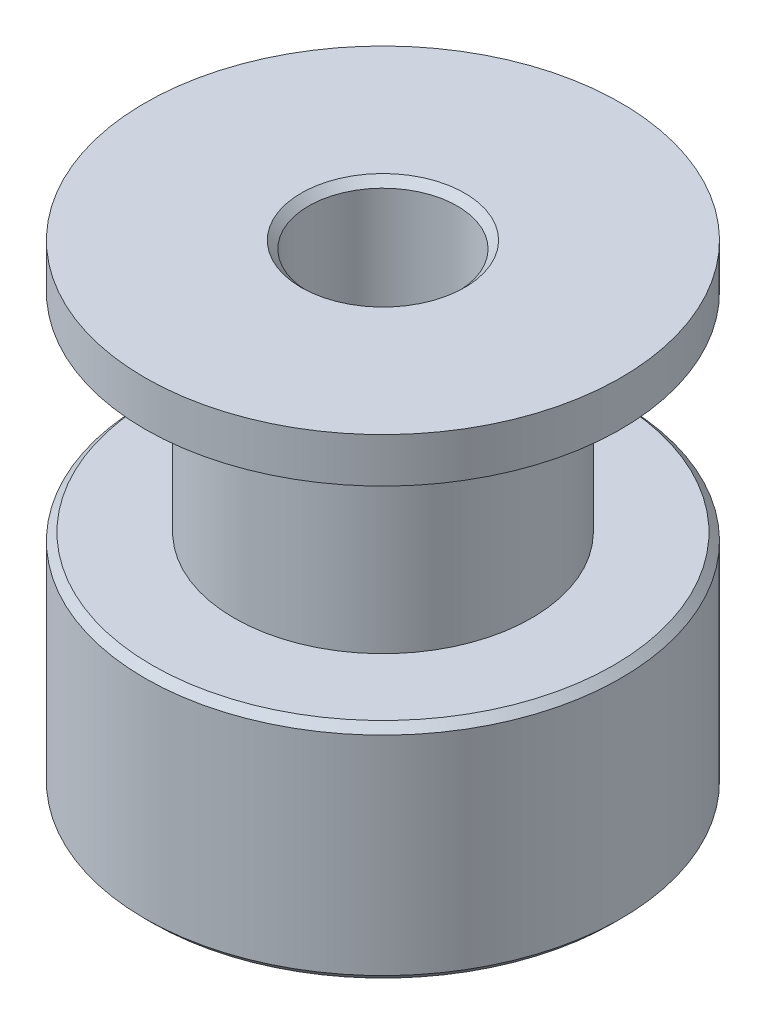
ISO-10303-21;
HEADER;
FILE_DESCRIPTION(('STEP AP214'),'2;1');
FILE_NAME('part.step','',(''),(''),'','','');
FILE_SCHEMA(('AUTOMOTIVE_DESIGN { 1 0 10303 214 1 1 1 1 }'));
ENDSEC;
DATA;
#1=APPLICATION_CONTEXT('core data for automotive mechanical design processes');
#2=APPLICATION_PROTOCOL_DEFINITION('international standard','automotive_design',2000,#1);
#3=PRODUCT_CONTEXT('',#1,'mechanical');
#4=PRODUCT('Part','Part','',(#3));
#5=PRODUCT_RELATED_PRODUCT_CATEGORY('part','',(#4));
#6=PRODUCT_DEFINITION_FORMATION('','',#4);
#7=PRODUCT_DEFINITION_CONTEXT('part definition',#1,'design');
#8=PRODUCT_DEFINITION('design','',#6,#7);
#9=PRODUCT_DEFINITION_SHAPE('','',#8);
#10=(LENGTH_UNIT() NAMED_UNIT(*) SI_UNIT(.MILLI.,.METRE.));
#11=(NAMED_UNIT(*) PLANE_ANGLE_UNIT() SI_UNIT($,.RADIAN.));
#12=(NAMED_UNIT(*) SI_UNIT($,.STERADIAN.) SOLID_ANGLE_UNIT());
#13=UNCERTAINTY_MEASURE_WITH_UNIT(LENGTH_MEASURE(1.E-05),#10,'distance_accuracy_value','');
#14=(GEOMETRIC_REPRESENTATION_CONTEXT(3) GLOBAL_UNCERTAINTY_ASSIGNED_CONTEXT((#13)) GLOBAL_UNIT_ASSIGNED_CONTEXT((#10,
#11,#12)) REPRESENTATION_CONTEXT('',''));
#15=CARTESIAN_POINT('',(0.,0.,0.));
#16=DIRECTION('',(0.,0.,1.));
#17=DIRECTION('',(1.,0.,0.));
#18=AXIS2_PLACEMENT_3D('',#15,#16,#17);
#19=CARTESIAN_POINT('',(0.,16.,0.));
#20=DIRECTION('',(0.,-1.,0.));
#21=DIRECTION('',(0.,0.,-1.));
#22=AXIS2_PLACEMENT_3D('',#19,#20,#21);
#23=CYLINDRICAL_SURFACE('',#22,8.);
#24=CARTESIAN_POINT('',(0.,0.249999999999993,0.));
#25=DIRECTION('',(0.,1.,0.));
#26=DIRECTION('',(0.,0.,1.));
#27=AXIS2_PLACEMENT_3D('',#24,#25,#26);
#28=CIRCLE('',#27,8.);
#29=CARTESIAN_POINT('',(0.,0.249999999999993,8.));
#30=VERTEX_POINT('',#29);
#31=EDGE_CURVE('E38',#30,#30,#28,.T.);
#32=ORIENTED_EDGE('',*,*,#31,.T.);
#33=EDGE_LOOP('',(#32));
#34=FACE_BOUND('',#33,.T.);
#35=CARTESIAN_POINT('',(0.,7.24999999999999,0.));
#36=DIRECTION('',(0.,1.,0.));
#37=DIRECTION('',(0.,0.,1.));
#38=AXIS2_PLACEMENT_3D('',#35,#36,#37);
#39=CIRCLE('',#38,8.);
#40=CARTESIAN_POINT('',(0.,7.24999999999999,8.));
#41=VERTEX_POINT('',#40);
#42=EDGE_CURVE('E42',#41,#41,#39,.F.);
#43=ORIENTED_EDGE('',*,*,#42,.T.);
#44=EDGE_LOOP('',(#43));
#45=FACE_BOUND('',#44,.T.);
#46=ADVANCED_FACE('F31',(#34,#45),#23,.T.);
#47=CARTESIAN_POINT('',(0.,16.,0.));
#48=DIRECTION('',(0.,1.,0.));
#49=DIRECTION('',(0.,0.,1.));
#50=AXIS2_PLACEMENT_3D('',#47,#48,#49);
#51=CIRCLE('',#50,8.);
#52=CARTESIAN_POINT('',(0.,16.,8.));
#53=VERTEX_POINT('',#52);
#54=EDGE_CURVE('E63',#53,#53,#51,.T.);
#55=ORIENTED_EDGE('',*,*,#54,.F.);
#56=EDGE_LOOP('',(#55));
#57=FACE_BOUND('',#56,.T.);
#58=CARTESIAN_POINT('',(0.,14.5,0.));
#59=DIRECTION('',(0.,1.,0.));
#60=DIRECTION('',(0.,0.,1.));
#61=AXIS2_PLACEMENT_3D('',#58,#59,#60);
#62=CIRCLE('',#61,8.);
#63=CARTESIAN_POINT('',(0.,14.5,8.));
#64=VERTEX_POINT('',#63);
#65=EDGE_CURVE('E72',#64,#64,#62,.T.);
#66=ORIENTED_EDGE('',*,*,#65,.T.);
#67=EDGE_LOOP('',(#66));
#68=FACE_BOUND('',#67,.T.);
#69=ADVANCED_FACE('F76',(#57,#68),#23,.T.);
#70=CARTESIAN_POINT('',(0.,16.,0.));
#71=DIRECTION('',(0.,1.,0.));
#72=DIRECTION('',(0.,0.,1.));
#73=AXIS2_PLACEMENT_3D('',#70,#71,#72);
#74=PLANE('',#73);
#75=CARTESIAN_POINT('',(0.,16.,0.));
#76=DIRECTION('',(0.,1.,0.));
#77=DIRECTION('',(0.,0.,1.));
#78=AXIS2_PLACEMENT_3D('',#75,#76,#77);
#79=CIRCLE('',#78,2.75);
#80=CARTESIAN_POINT('',(0.,16.,2.75));
#81=VERTEX_POINT('',#80);
#82=EDGE_CURVE('E46',#81,#81,#79,.F.);
#83=ORIENTED_EDGE('',*,*,#82,.T.);
#84=EDGE_LOOP('',(#83));
#85=FACE_BOUND('',#84,.T.);
#86=ORIENTED_EDGE('',*,*,#54,.T.);
#87=EDGE_LOOP('',(#86));
#88=FACE_BOUND('',#87,.T.);
#89=ADVANCED_FACE('F99',(#85,#88),#74,.T.);
#90=CARTESIAN_POINT('',(0.,0.,0.));
#91=DIRECTION('',(0.,1.,0.));
#92=DIRECTION('',(0.,0.,1.));
#93=AXIS2_PLACEMENT_3D('',#90,#91,#92);
#94=PLANE('',#93);
#95=CARTESIAN_POINT('',(0.,0.,0.));
#96=DIRECTION('',(0.,1.,0.));
#97=DIRECTION('',(0.,0.,1.));
#98=AXIS2_PLACEMENT_3D('',#95,#96,#97);
#99=CIRCLE('',#98,2.75);
#100=CARTESIAN_POINT('',(0.,0.,2.75));
#101=VERTEX_POINT('',#100);
#102=EDGE_CURVE('E51',#101,#101,#99,.T.);
#103=ORIENTED_EDGE('',*,*,#102,.T.);
#104=EDGE_LOOP('',(#103));
#105=FACE_BOUND('',#104,.T.);
#106=CARTESIAN_POINT('',(0.,0.,0.));
#107=DIRECTION('',(0.,1.,0.));
#108=DIRECTION('',(0.,0.,1.));
#109=AXIS2_PLACEMENT_3D('',#106,#107,#108);
#110=CIRCLE('',#109,7.75);
#111=CARTESIAN_POINT('',(0.,0.,7.75));
#112=VERTEX_POINT('',#111);
#113=EDGE_CURVE('E54',#112,#112,#110,.F.);
#114=ORIENTED_EDGE('',*,*,#113,.T.);
#115=EDGE_LOOP('',(#114));
#116=FACE_BOUND('',#115,.T.);
#117=ADVANCED_FACE('F103',(#105,#116),#94,.F.);
#118=CARTESIAN_POINT('',(0.,-7.07106781186548,0.));
#119=DIRECTION('',(0.,1.,0.));
#120=DIRECTION('',(0.,0.,1.));
#121=AXIS2_PLACEMENT_3D('',#118,#119,#120);
#122=CYLINDRICAL_SURFACE('',#121,2.5);
#123=CARTESIAN_POINT('',(0.,0.25,0.));
#124=DIRECTION('',(0.,1.,0.));
#125=DIRECTION('',(0.,0.,1.));
#126=AXIS2_PLACEMENT_3D('',#123,#124,#125);
#127=CIRCLE('',#126,2.5);
#128=CARTESIAN_POINT('',(0.,0.25,2.5));
#129=VERTEX_POINT('',#128);
#130=EDGE_CURVE('E57',#129,#129,#127,.F.);
#131=ORIENTED_EDGE('',*,*,#130,.T.);
#132=EDGE_LOOP('',(#131));
#133=FACE_BOUND('',#132,.T.);
#134=CARTESIAN_POINT('',(0.,15.75,0.));
#135=DIRECTION('',(0.,1.,0.));
#136=DIRECTION('',(0.,0.,1.));
#137=AXIS2_PLACEMENT_3D('',#134,#135,#136);
#138=CIRCLE('',#137,2.5);
#139=CARTESIAN_POINT('',(0.,15.75,2.5));
#140=VERTEX_POINT('',#139);
#141=EDGE_CURVE('E60',#140,#140,#138,.T.);
#142=ORIENTED_EDGE('',*,*,#141,.T.);
#143=EDGE_LOOP('',(#142));
#144=FACE_BOUND('',#143,.T.);
#145=ADVANCED_FACE('F119',(#133,#144),#122,.F.);
#146=CARTESIAN_POINT('',(8.,7.5,0.));
#147=DIRECTION('',(0.,1.,0.));
#148=DIRECTION('',(0.,0.,1.));
#149=AXIS2_PLACEMENT_3D('',#146,#147,#148);
#150=PLANE('',#149);
#151=CARTESIAN_POINT('',(0.,7.5,0.));
#152=DIRECTION('',(0.,1.,0.));
#153=DIRECTION('',(0.,0.,1.));
#154=AXIS2_PLACEMENT_3D('',#151,#152,#153);
#155=CIRCLE('',#154,7.74999999999999);
#156=CARTESIAN_POINT('',(0.,7.5,7.74999999999999));
#157=VERTEX_POINT('',#156);
#158=EDGE_CURVE('E10',#157,#157,#155,.T.);
#159=ORIENTED_EDGE('',*,*,#158,.T.);
#160=EDGE_LOOP('',(#159));
#161=FACE_BOUND('',#160,.T.);
#162=CARTESIAN_POINT('',(0.,7.5,0.));
#163=DIRECTION('',(0.,1.,0.));
#164=DIRECTION('',(0.,0.,1.));
#165=AXIS2_PLACEMENT_3D('',#162,#163,#164);
#166=CIRCLE('',#165,5.);
#167=CARTESIAN_POINT('',(0.,7.5,5.));
#168=VERTEX_POINT('',#167);
#169=EDGE_CURVE('E66',#168,#168,#166,.T.);
#170=ORIENTED_EDGE('',*,*,#169,.F.);
#171=EDGE_LOOP('',(#170));
#172=FACE_BOUND('',#171,.T.);
#173=ADVANCED_FACE('F91',(#161,#172),#150,.T.);
#174=CARTESIAN_POINT('',(0.,16.,0.));
#175=DIRECTION('',(0.,1.,0.));
#176=DIRECTION('',(0.,0.,1.));
#177=AXIS2_PLACEMENT_3D('',#174,#175,#176);
#178=CYLINDRICAL_SURFACE('',#177,5.);
#179=ORIENTED_EDGE('',*,*,#169,.T.);
#180=EDGE_LOOP('',(#179));
#181=FACE_BOUND('',#180,.T.);
#182=CARTESIAN_POINT('',(0.,14.5,0.));
#183=DIRECTION('',(0.,1.,0.));
#184=DIRECTION('',(0.,0.,1.));
#185=AXIS2_PLACEMENT_3D('',#182,#183,#184);
#186=CIRCLE('',#185,5.);
#187=CARTESIAN_POINT('',(0.,14.5,5.));
#188=VERTEX_POINT('',#187);
#189=EDGE_CURVE('E69',#188,#188,#186,.T.);
#190=ORIENTED_EDGE('',*,*,#189,.F.);
#191=EDGE_LOOP('',(#190));
#192=FACE_BOUND('',#191,.T.);
#193=ADVANCED_FACE('F81',(#181,#192),#178,.T.);
#194=CARTESIAN_POINT('',(8.,14.5,0.));
#195=DIRECTION('',(0.,-1.,0.));
#196=DIRECTION('',(0.,0.,-1.));
#197=AXIS2_PLACEMENT_3D('',#194,#195,#196);
#198=PLANE('',#197);
#199=ORIENTED_EDGE('',*,*,#189,.T.);
#200=EDGE_LOOP('',(#199));
#201=FACE_BOUND('',#200,.T.);
#202=ORIENTED_EDGE('',*,*,#65,.F.);
#203=EDGE_LOOP('',(#202));
#204=FACE_BOUND('',#203,.T.);
#205=ADVANCED_FACE('F78',(#201,#204),#198,.T.);
#206=CARTESIAN_POINT('',(0.,0.25,0.));
#207=DIRECTION('',(0.,-1.,0.));
#208=DIRECTION('',(0.,0.,-1.));
#209=AXIS2_PLACEMENT_3D('',#206,#207,#208);
#210=CONICAL_SURFACE('',#209,2.5,0.785398163397453);
#211=ORIENTED_EDGE('',*,*,#102,.F.);
#212=EDGE_LOOP('',(#211));
#213=FACE_BOUND('',#212,.T.);
#214=ORIENTED_EDGE('',*,*,#130,.F.);
#215=EDGE_LOOP('',(#214));
#216=FACE_BOUND('',#215,.T.);
#217=ADVANCED_FACE('F80',(#213,#216),#210,.F.);
#218=CARTESIAN_POINT('',(0.,15.75,0.));
#219=DIRECTION('',(0.,1.,0.));
#220=DIRECTION('',(0.,0.,1.));
#221=AXIS2_PLACEMENT_3D('',#218,#219,#220);
#222=CONICAL_SURFACE('',#221,2.5,0.785398163397446);
#223=ORIENTED_EDGE('',*,*,#82,.F.);
#224=EDGE_LOOP('',(#223));
#225=FACE_BOUND('',#224,.T.);
#226=ORIENTED_EDGE('',*,*,#141,.F.);
#227=EDGE_LOOP('',(#226));
#228=FACE_BOUND('',#227,.T.);
#229=ADVANCED_FACE('F88',(#225,#228),#222,.F.);
#230=CARTESIAN_POINT('',(0.,0.249999999999993,0.));
#231=DIRECTION('',(0.,1.,0.));
#232=DIRECTION('',(0.,0.,1.));
#233=AXIS2_PLACEMENT_3D('',#230,#231,#232);
#234=CONICAL_SURFACE('',#233,8.,0.785398163397459);
#235=ORIENTED_EDGE('',*,*,#113,.F.);
#236=EDGE_LOOP('',(#235));
#237=FACE_BOUND('',#236,.T.);
#238=ORIENTED_EDGE('',*,*,#31,.F.);
#239=EDGE_LOOP('',(#238));
#240=FACE_BOUND('',#239,.T.);
#241=ADVANCED_FACE('F107',(#237,#240),#234,.T.);
#242=CARTESIAN_POINT('',(0.,7.5,0.));
#243=DIRECTION('',(0.,-1.,0.));
#244=DIRECTION('',(0.,0.,-1.));
#245=AXIS2_PLACEMENT_3D('',#242,#243,#244);
#246=CONICAL_SURFACE('',#245,7.74999999999999,0.785398163397441);
#247=ORIENTED_EDGE('',*,*,#42,.F.);
#248=EDGE_LOOP('',(#247));
#249=FACE_BOUND('',#248,.T.);
#250=ORIENTED_EDGE('',*,*,#158,.F.);
#251=EDGE_LOOP('',(#250));
#252=FACE_BOUND('',#251,.T.);
#253=ADVANCED_FACE('F33',(#249,#252),#246,.T.);
#254=CLOSED_SHELL('',(#46,#69,#89,#117,#145,#173,#193,#205,#217,#229,#241,#253));
#255=MANIFOLD_SOLID_BREP('B2',#254);
#256=ADVANCED_BREP_SHAPE_REPRESENTATION('',(#18,#255),#14);
#257=SHAPE_DEFINITION_REPRESENTATION(#9,#256);
ENDSEC;
END-ISO-10303-21;
